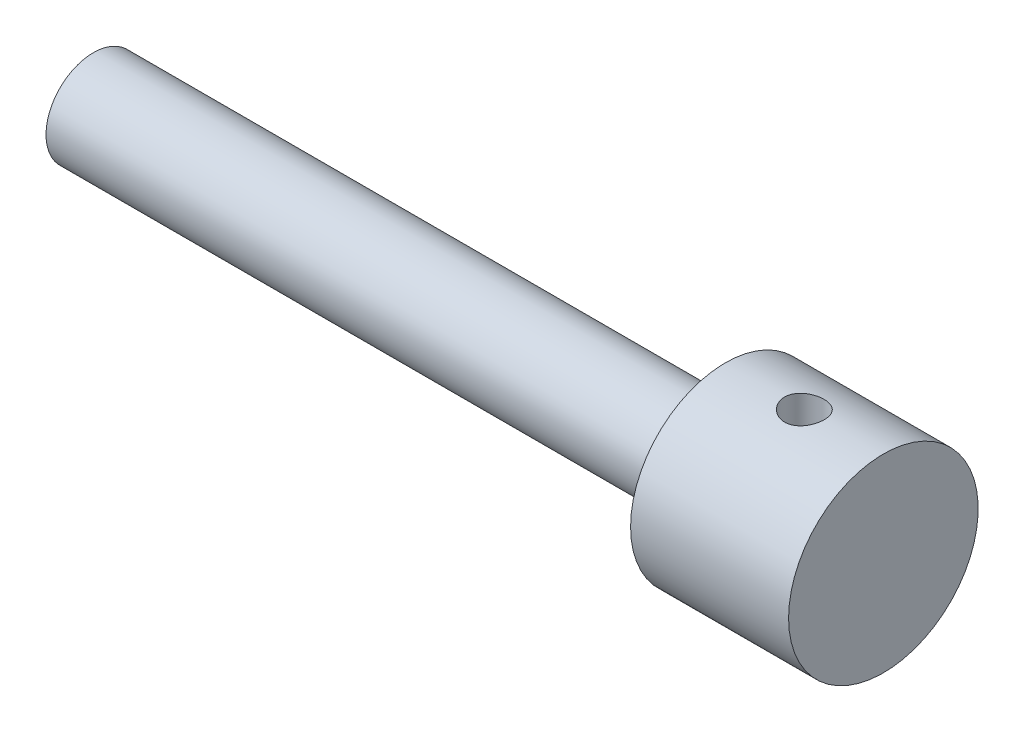
ISO-10303-21;
HEADER;
FILE_DESCRIPTION(('STEP AP214'),'2;1');
FILE_NAME('part.step','',(''),(''),'','','');
FILE_SCHEMA(('AUTOMOTIVE_DESIGN { 1 0 10303 214 1 1 1 1 }'));
ENDSEC;
DATA;
#1=APPLICATION_CONTEXT('core data for automotive mechanical design processes');
#2=APPLICATION_PROTOCOL_DEFINITION('international standard','automotive_design',2000,#1);
#3=PRODUCT_CONTEXT('',#1,'mechanical');
#4=PRODUCT('Part','Part','',(#3));
#5=PRODUCT_RELATED_PRODUCT_CATEGORY('part','',(#4));
#6=PRODUCT_DEFINITION_FORMATION('','',#4);
#7=PRODUCT_DEFINITION_CONTEXT('part definition',#1,'design');
#8=PRODUCT_DEFINITION('design','',#6,#7);
#9=PRODUCT_DEFINITION_SHAPE('','',#8);
#10=(LENGTH_UNIT() NAMED_UNIT(*) SI_UNIT(.MILLI.,.METRE.));
#11=(NAMED_UNIT(*) PLANE_ANGLE_UNIT() SI_UNIT($,.RADIAN.));
#12=(NAMED_UNIT(*) SI_UNIT($,.STERADIAN.) SOLID_ANGLE_UNIT());
#13=UNCERTAINTY_MEASURE_WITH_UNIT(LENGTH_MEASURE(1.E-05),#10,'distance_accuracy_value','');
#14=(GEOMETRIC_REPRESENTATION_CONTEXT(3) GLOBAL_UNCERTAINTY_ASSIGNED_CONTEXT((#13)) GLOBAL_UNIT_ASSIGNED_CONTEXT((#10,
#11,#12)) REPRESENTATION_CONTEXT('',''));
#15=CARTESIAN_POINT('',(0.,0.,0.));
#16=DIRECTION('',(0.,0.,1.));
#17=DIRECTION('',(1.,0.,0.));
#18=AXIS2_PLACEMENT_3D('',#15,#16,#17);
#19=CARTESIAN_POINT('',(0.,0.,0.));
#20=DIRECTION('',(1.,0.,0.));
#21=DIRECTION('',(0.,0.,-1.));
#22=AXIS2_PLACEMENT_3D('',#19,#20,#21);
#23=PLANE('',#22);
#24=CARTESIAN_POINT('',(0.,0.,0.));
#25=DIRECTION('',(-1.,0.,0.));
#26=DIRECTION('',(0.,0.,1.));
#27=AXIS2_PLACEMENT_3D('',#24,#25,#26);
#28=CIRCLE('',#27,6.);
#29=CARTESIAN_POINT('',(0.,0.,6.));
#30=VERTEX_POINT('',#29);
#31=EDGE_CURVE('E46',#30,#30,#28,.T.);
#32=ORIENTED_EDGE('',*,*,#31,.T.);
#33=EDGE_LOOP('',(#32));
#34=FACE_BOUND('',#33,.T.);
#35=ADVANCED_FACE('F31',(#34),#23,.F.);
#36=CARTESIAN_POINT('',(0.,0.,0.));
#37=DIRECTION('',(-1.,0.,0.));
#38=DIRECTION('',(0.,0.,1.));
#39=AXIS2_PLACEMENT_3D('',#36,#37,#38);
#40=CYLINDRICAL_SURFACE('',#39,6.);
#41=ORIENTED_EDGE('',*,*,#31,.F.);
#42=EDGE_LOOP('',(#41));
#43=FACE_BOUND('',#42,.T.);
#44=CARTESIAN_POINT('',(80.,0.,0.));
#45=DIRECTION('',(-1.,0.,0.));
#46=DIRECTION('',(0.,0.,1.));
#47=AXIS2_PLACEMENT_3D('',#44,#45,#46);
#48=CIRCLE('',#47,6.);
#49=CARTESIAN_POINT('',(80.,0.,6.));
#50=VERTEX_POINT('',#49);
#51=EDGE_CURVE('E50',#50,#50,#48,.T.);
#52=ORIENTED_EDGE('',*,*,#51,.T.);
#53=EDGE_LOOP('',(#52));
#54=FACE_BOUND('',#53,.T.);
#55=ADVANCED_FACE('F74',(#43,#54),#40,.T.);
#56=CARTESIAN_POINT('',(80.,6.,0.));
#57=DIRECTION('',(1.,0.,0.));
#58=DIRECTION('',(0.,0.,-1.));
#59=AXIS2_PLACEMENT_3D('',#56,#57,#58);
#60=PLANE('',#59);
#61=ORIENTED_EDGE('',*,*,#51,.F.);
#62=EDGE_LOOP('',(#61));
#63=FACE_BOUND('',#62,.T.);
#64=CARTESIAN_POINT('',(80.,0.,0.));
#65=DIRECTION('',(-1.,0.,0.));
#66=DIRECTION('',(0.,0.,1.));
#67=AXIS2_PLACEMENT_3D('',#64,#65,#66);
#68=CIRCLE('',#67,12.);
#69=CARTESIAN_POINT('',(80.,0.,12.));
#70=VERTEX_POINT('',#69);
#71=EDGE_CURVE('E85',#70,#70,#68,.T.);
#72=ORIENTED_EDGE('',*,*,#71,.T.);
#73=EDGE_LOOP('',(#72));
#74=FACE_BOUND('',#73,.T.);
#75=ADVANCED_FACE('F71',(#63,#74),#60,.F.);
#76=CARTESIAN_POINT('',(0.,0.,0.));
#77=DIRECTION('',(-1.,0.,0.));
#78=DIRECTION('',(0.,0.,1.));
#79=AXIS2_PLACEMENT_3D('',#76,#77,#78);
#80=CYLINDRICAL_SURFACE('',#79,12.);
#81=CARTESIAN_POINT('',(87.5,12.,0.));
#82=CARTESIAN_POINT('',(87.5000049549385,11.999997430533,-0.138818083403322));
#83=CARTESIAN_POINT('',(87.5116013314375,11.9975665755009,-0.277697579041751));
#84=CARTESIAN_POINT('',(87.5576386990657,11.9881040198136,-0.551522632533987));
#85=CARTESIAN_POINT('',(87.5920970460739,11.981068823785,-0.686465120256625));
#86=CARTESIAN_POINT('',(87.6827409098437,11.963182183924,-0.948418264582684));
#87=CARTESIAN_POINT('',(87.7389047919978,11.9523345410529,-1.07543667341837));
#88=CARTESIAN_POINT('',(87.8712992177124,11.9279985561972,-1.31824065721192));
#89=CARTESIAN_POINT('',(87.9475288623117,11.9145103325195,-1.43402673506865));
#90=CARTESIAN_POINT('',(88.1190726803813,11.886154000493,-1.65278064861767));
#91=CARTESIAN_POINT('',(88.2146240024702,11.8712701169706,-1.75556048832537));
#92=CARTESIAN_POINT('',(88.4215893183902,11.841913153849,-1.94375555353878));
#93=CARTESIAN_POINT('',(88.5330046237445,11.8274401083337,-2.02916934192197));
#94=CARTESIAN_POINT('',(88.7699039375323,11.8003888519062,-2.18102063354433));
#95=CARTESIAN_POINT('',(88.8955167690055,11.7878309034966,-2.24726109361301));
#96=CARTESIAN_POINT('',(89.1563949035455,11.7662568130004,-2.35762238696127));
#97=CARTESIAN_POINT('',(89.2916591648851,11.7572402893514,-2.40174560335282));
#98=CARTESIAN_POINT('',(89.5659704748313,11.7439300197224,-2.46600480267473));
#99=CARTESIAN_POINT('',(89.7049367186695,11.7395711371173,-2.48647195393597));
#100=CARTESIAN_POINT('',(89.9843936857253,11.7358738143298,-2.50386715311229));
#101=CARTESIAN_POINT('',(90.1248842377306,11.7365348160196,-2.50079781789373));
#102=CARTESIAN_POINT('',(90.4009620559504,11.7427434863835,-2.47147438074394));
#103=CARTESIAN_POINT('',(90.5365919593224,11.748210673598,-2.4456021046544));
#104=CARTESIAN_POINT('',(90.8015430192899,11.7632887523188,-2.3720108705989));
#105=CARTESIAN_POINT('',(90.9308638512127,11.7728998568263,-2.32429078962764));
#106=CARTESIAN_POINT('',(91.180614456832,11.795263829282,-2.20800006427857));
#107=CARTESIAN_POINT('',(91.3009725930542,11.8080390757117,-2.13928005068473));
#108=CARTESIAN_POINT('',(91.5285914885363,11.8352778002144,-1.98304539854963));
#109=CARTESIAN_POINT('',(91.635850617672,11.8497414879707,-1.89552842452517));
#110=CARTESIAN_POINT('',(91.8364279221608,11.8790746185982,-1.70214984309356));
#111=CARTESIAN_POINT('',(91.929432337794,11.8939464639895,-1.59596286682416));
#112=CARTESIAN_POINT('',(92.096360884458,11.92216176286,-1.36933457722359));
#113=CARTESIAN_POINT('',(92.1702847291968,11.9355051934047,-1.24889305005153));
#114=CARTESIAN_POINT('',(92.2970201630719,11.9591974188563,-0.996811082470948));
#115=CARTESIAN_POINT('',(92.3497936091342,11.9695407942052,-0.86515092385299));
#116=CARTESIAN_POINT('',(92.432383409671,11.9860267642256,-0.594569241944301));
#117=CARTESIAN_POINT('',(92.4622027864628,11.9921699119211,-0.455648677190173));
#118=CARTESIAN_POINT('',(92.4975885041358,11.9994855043091,-0.177183731401668));
#119=CARTESIAN_POINT('',(92.5035838829885,12.0007458707516,-0.0376961110523548));
#120=CARTESIAN_POINT('',(92.4923101000618,11.9983990450555,0.24028759751543));
#121=CARTESIAN_POINT('',(92.4750423627968,11.9947921509631,0.378783745924516));
#122=CARTESIAN_POINT('',(92.4180886930609,11.9831712995837,0.649452734239627));
#123=CARTESIAN_POINT('',(92.3786250292331,11.9752010573615,0.781674385788414));
#124=CARTESIAN_POINT('',(92.2786442791572,11.9557445448479,1.03762289332266));
#125=CARTESIAN_POINT('',(92.218125518268,11.9442579948916,1.16134907267355));
#126=CARTESIAN_POINT('',(92.0768392435249,11.9188248298143,1.39858861388699));
#127=CARTESIAN_POINT('',(91.9958161408619,11.9048478762466,1.51194643893966));
#128=CARTESIAN_POINT('',(91.8161608738475,11.8760513659942,1.72361089177304));
#129=CARTESIAN_POINT('',(91.7175266489621,11.8612317108502,1.82191575582657));
#130=CARTESIAN_POINT('',(91.5034888460006,11.8321204906275,2.0023572973036));
#131=CARTESIAN_POINT('',(91.3878339360895,11.81784178615,2.08419829200408));
#132=CARTESIAN_POINT('',(91.1441674315724,11.7917120203161,2.22729438158486));
#133=CARTESIAN_POINT('',(91.0161563517218,11.779860857893,2.28855033355728));
#134=CARTESIAN_POINT('',(90.7520776074035,11.7600340141608,2.38834492887844));
#135=CARTESIAN_POINT('',(90.6160579256683,11.7520374556937,2.42700619656063));
#136=CARTESIAN_POINT('',(90.3392668990155,11.7407836941939,2.48088077046814));
#137=CARTESIAN_POINT('',(90.1984962367611,11.7375258132073,2.49609743088881));
#138=CARTESIAN_POINT('',(89.9191731980007,11.7361581461701,2.50251852975222));
#139=CARTESIAN_POINT('',(89.7806318595559,11.73794804643,2.4941908524545));
#140=CARTESIAN_POINT('',(89.5069719821596,11.7462489450985,2.45479810628063));
#141=CARTESIAN_POINT('',(89.3718534103678,11.7527598981925,2.42373325564532));
#142=CARTESIAN_POINT('',(89.1092044562187,11.7697226489543,2.33996435537169));
#143=CARTESIAN_POINT('',(88.9816535070262,11.7801631401586,2.28732235136842));
#144=CARTESIAN_POINT('',(88.7371224479467,11.8038141147748,2.16194914599514));
#145=CARTESIAN_POINT('',(88.6201433207338,11.8170248553092,2.0892160796606));
#146=CARTESIAN_POINT('',(88.3977567458411,11.8450315910229,1.92414739068482));
#147=CARTESIAN_POINT('',(88.29260175087,11.8598522773681,1.83147578083645));
#148=CARTESIAN_POINT('',(88.0991810135473,11.8892367916643,1.62984887623067));
#149=CARTESIAN_POINT('',(88.010919164897,11.9038005596976,1.52088983766594));
#150=CARTESIAN_POINT('',(87.8528228536319,11.9312288909527,1.28826885501541));
#151=CARTESIAN_POINT('',(87.7832126402274,11.9440719214649,1.1644518430427));
#152=CARTESIAN_POINT('',(87.66589954314,11.9663981698818,0.906639687996905));
#153=CARTESIAN_POINT('',(87.6181775056363,11.975884323642,0.772653563814483));
#154=CARTESIAN_POINT('',(87.5549194434232,11.9886499956289,0.532030585800206));
#155=CARTESIAN_POINT('',(87.5343624735823,11.9928807132279,0.426735187455855));
#156=CARTESIAN_POINT('',(87.5069010914453,11.9985566557952,0.214305348353073));
#157=CARTESIAN_POINT('',(87.4999961746656,12.0000019836917,0.107170975697743));
#158=CARTESIAN_POINT('',(87.5,12.,0.));
#159=B_SPLINE_CURVE_WITH_KNOTS('',3,(#81,#82,#83,#84,#85,#86,#87,#88,#89,#90,#91,#92,#93,#94,
#95,#96,#97,#98,#99,#100,#101,#102,#103,#104,#105,#106,#107,#108,#109,#110,#111,#112,#113,#114,
#115,#116,#117,#118,#119,#120,#121,#122,#123,#124,#125,#126,#127,#128,#129,#130,#131,#132,#133,
#134,#135,#136,#137,#138,#139,#140,#141,#142,#143,#144,#145,#146,#147,#148,#149,#150,#151,#152,
#153,#154,#155,#156,#157,#158),.UNSPECIFIED.,.T.,.F.,(4,2,2,2,2,2,2,2,2,2,2,2,2,2,2,2,2,2,2,2,2,
2,2,2,2,2,2,2,2,2,2,2,2,2,2,2,2,2,4),(0.,0.416062090206366,0.832440399812449,1.24840475765089,
1.66435048314598,2.08575052776244,2.50718543103571,2.93280898357096,3.3583866657098,
3.77793150339708,4.19742969534329,4.61003424258117,5.02266000060558,5.43829184833498,
5.85397536736069,6.27779052710931,6.70161204556436,7.12619448999325,7.55072102091542,
7.9675667881535,8.38438703104554,8.79710573265242,9.20985726781866,9.62803167991471,
10.0462550512915,10.4714252765867,10.8965777970262,11.3194010019005,11.7421637082837,
12.1565844658208,12.5710012456272,12.9842346278651,13.3975063816296,13.8183804966062,
14.2393515023474,14.6651772879651,15.0906297292995,15.4118517695456,15.7330619394678),.UNSPECIFIED.);
#160=CARTESIAN_POINT('',(87.5,12.,0.));
#161=VERTEX_POINT('',#160);
#162=EDGE_CURVE('E10',#161,#161,#159,.T.);
#163=ORIENTED_EDGE('',*,*,#162,.T.);
#164=EDGE_LOOP('',(#163));
#165=FACE_BOUND('',#164,.T.);
#166=CARTESIAN_POINT('',(90.,-11.7366945943055,-2.5));
#167=CARTESIAN_POINT('',(89.8612187696963,-11.7366973843002,-2.49999501755299));
#168=CARTESIAN_POINT('',(89.7223760559691,-11.7391829184982,-2.48840458867922));
#169=CARTESIAN_POINT('',(89.448627365366,-11.7488403116286,-2.44239298467531));
#170=CARTESIAN_POINT('',(89.3137244889873,-11.7560157627658,-2.40795430880677));
#171=CARTESIAN_POINT('',(89.0518552543301,-11.7742058592406,-2.31736795014467));
#172=CARTESIAN_POINT('',(88.9248808080164,-11.7852165141394,-2.26124282497866));
#173=CARTESIAN_POINT('',(88.6821510007088,-11.8098316267143,-2.12893977203462));
#174=CARTESIAN_POINT('',(88.56639518654,-11.8234359795523,-2.05276265471639));
#175=CARTESIAN_POINT('',(88.3476092496931,-11.8519386932295,-1.88127279893217));
#176=CARTESIAN_POINT('',(88.2447762127471,-11.8668522874608,-1.78571110973933));
#177=CARTESIAN_POINT('',(88.0564778627038,-11.8961593360515,-1.57870244776127));
#178=CARTESIAN_POINT('',(87.9710138234171,-11.9105527521983,-1.467254310912));
#179=CARTESIAN_POINT('',(87.8191082238343,-11.937362702377,-1.23032410599918));
#180=CARTESIAN_POINT('',(87.7528549470735,-11.9497591726249,-1.10471885640989));
#181=CARTESIAN_POINT('',(87.6424678942805,-11.971006946866,-0.843857102013443));
#182=CARTESIAN_POINT('',(87.598331869693,-11.9798586112244,-0.708601579901186));
#183=CARTESIAN_POINT('',(87.5340484777651,-11.9929117978436,-0.434325808401008));
#184=CARTESIAN_POINT('',(87.5135679656097,-11.9971778391985,-0.295386761832718));
#185=CARTESIAN_POINT('',(87.496136608486,-12.0008022516122,-0.0159836976790503));
#186=CARTESIAN_POINT('',(87.4991833116138,-12.0001611340738,0.124480159473676));
#187=CARTESIAN_POINT('',(87.5284692019135,-11.9940931618102,0.400653172399142));
#188=CARTESIAN_POINT('',(87.5543494379162,-11.9887403791317,0.536402257452947));
#189=CARTESIAN_POINT('',(87.6279972506626,-11.9739344179777,0.8015874925795));
#190=CARTESIAN_POINT('',(87.6757657544062,-11.9644810658381,0.93102337502204));
#191=CARTESIAN_POINT('',(87.792160104251,-11.9424153464785,1.18092001076936));
#192=CARTESIAN_POINT('',(87.8609245884193,-11.9297820825069,1.30131426996329));
#193=CARTESIAN_POINT('',(88.0172560056808,-11.9027460088038,1.52898691302129));
#194=CARTESIAN_POINT('',(88.1048252764123,-11.8883429791665,1.63626366363284));
#195=CARTESIAN_POINT('',(88.2982432497821,-11.8590340046655,1.83678840655382));
#196=CARTESIAN_POINT('',(88.4044061199639,-11.8441236995185,1.92973297498958));
#197=CARTESIAN_POINT('',(88.6309640979896,-11.8157374529799,2.09655194480975));
#198=CARTESIAN_POINT('',(88.7513595227745,-11.8022615435432,2.17042592139959));
#199=CARTESIAN_POINT('',(89.0034245096576,-11.7782599681831,2.29712434276908));
#200=CARTESIAN_POINT('',(89.1351213013869,-11.7677417046425,2.34989610979454));
#201=CARTESIAN_POINT('',(89.4057832387388,-11.7509521282072,2.43247155077345));
#202=CARTESIAN_POINT('',(89.5447473456162,-11.7446802101436,2.46227849764697));
#203=CARTESIAN_POINT('',(89.8232394126378,-11.7372156647826,2.49761727734034));
#204=CARTESIAN_POINT('',(89.9627091690741,-11.7359310372695,2.50358885835996));
#205=CARTESIAN_POINT('',(90.2406516230803,-11.7383390403741,2.49227386878588));
#206=CARTESIAN_POINT('',(90.3791243818047,-11.7420313630525,2.47498873715725));
#207=CARTESIAN_POINT('',(90.6496410321163,-11.7538907645233,2.41803116650967));
#208=CARTESIAN_POINT('',(90.7817373343577,-11.7620102256599,2.37859682753742));
#209=CARTESIAN_POINT('',(91.0374479788832,-11.7817667700624,2.27871621721838));
#210=CARTESIAN_POINT('',(91.1610615713008,-11.7934041638211,2.21826809112292));
#211=CARTESIAN_POINT('',(91.3982128824325,-11.8190900387438,2.07709196362969));
#212=CARTESIAN_POINT('',(91.5115844089323,-11.8331701329665,1.99609065470792));
#213=CARTESIAN_POINT('',(91.7232864983101,-11.8620696798782,1.81646888113976));
#214=CARTESIAN_POINT('',(91.8216153724785,-11.8768892153306,1.71784644101035));
#215=CARTESIAN_POINT('',(92.0021254261943,-11.9058984863347,1.50380090168669));
#216=CARTESIAN_POINT('',(92.0840081900528,-11.9200734943982,1.38812381522911));
#217=CARTESIAN_POINT('',(92.227177504176,-11.9459341754481,1.14440020443272));
#218=CARTESIAN_POINT('',(92.2884649644749,-11.9576199584164,1.01635422695376));
#219=CARTESIAN_POINT('',(92.3882773586347,-11.9771229654136,0.752284235695839));
#220=CARTESIAN_POINT('',(92.4269383310887,-11.9849632627299,0.616313421940391));
#221=CARTESIAN_POINT('',(92.4808288080162,-11.9959912282046,0.339626801006942));
#222=CARTESIAN_POINT('',(92.4960613870655,-11.9991795068579,0.198911618923384));
#223=CARTESIAN_POINT('',(92.502535244097,-12.0005281611387,-0.0804266869406725));
#224=CARTESIAN_POINT('',(92.4942237999895,-11.9987822750957,-0.219039184355822));
#225=CARTESIAN_POINT('',(92.4548387226941,-11.99065748189,-0.492845740747126));
#226=CARTESIAN_POINT('',(92.4237654271863,-11.9842786434588,-0.628039850405486));
#227=CARTESIAN_POINT('',(92.339944410703,-11.9676092015489,-0.890863930984017));
#228=CARTESIAN_POINT('',(92.2872546722943,-11.9573290681437,-1.01851310000873));
#229=CARTESIAN_POINT('',(92.1617552045355,-11.9339599069615,-1.26322113444179));
#230=CARTESIAN_POINT('',(92.0889437233117,-11.9208706346327,-1.38027907656018));
#231=CARTESIAN_POINT('',(91.9237806640155,-11.8930319356995,-1.60268064259533));
#232=CARTESIAN_POINT('',(91.8311114238945,-11.8782576059507,-1.70778526722739));
#233=CARTESIAN_POINT('',(91.6295109979979,-11.8488557363333,-1.90110548396523));
#234=CARTESIAN_POINT('',(91.5205759400736,-11.8342282323044,-1.98931704315914));
#235=CARTESIAN_POINT('',(91.287981795159,-11.8065838324643,-2.14734903704121));
#236=CARTESIAN_POINT('',(91.1641631771794,-11.7935881325424,-2.21693856248135));
#237=CARTESIAN_POINT('',(90.9063496879379,-11.7709407916825,-2.33421255844769));
#238=CARTESIAN_POINT('',(90.7723639031215,-11.7612862067076,-2.38191632583499));
#239=CARTESIAN_POINT('',(90.5317874368468,-11.7482800883641,-2.44513108264677));
#240=CARTESIAN_POINT('',(90.4265409268095,-11.7439632719021,-2.46566898011598));
#241=CARTESIAN_POINT('',(90.2142084389624,-11.7381695052653,-2.4931050871655));
#242=CARTESIAN_POINT('',(90.1071225353813,-11.7366924407628,-2.50000384585404));
#243=CARTESIAN_POINT('',(90.,-11.7366945943055,-2.5));
#244=B_SPLINE_CURVE_WITH_KNOTS('',3,(#166,#167,#168,#169,#170,#171,#172,#173,#174,#175,#176,
#177,#178,#179,#180,#181,#182,#183,#184,#185,#186,#187,#188,#189,#190,#191,#192,#193,#194,#195,
#196,#197,#198,#199,#200,#201,#202,#203,#204,#205,#206,#207,#208,#209,#210,#211,#212,#213,#214,
#215,#216,#217,#218,#219,#220,#221,#222,#223,#224,#225,#226,#227,#228,#229,#230,#231,#232,#233,
#234,#235,#236,#237,#238,#239,#240,#241,#242,#243),.UNSPECIFIED.,.T.,.F.,(4,2,2,2,2,2,2,2,2,2,2,
2,2,2,2,2,2,2,2,2,2,2,2,2,2,2,2,2,2,2,2,2,2,2,2,2,2,2,4),(0.,0.415951308142525,0.83222158483494,
1.24806002960546,1.66388166963158,2.08542666935771,2.50700257327746,2.93258052533686,
3.35811520213865,3.77758097718528,4.19700303792677,4.60994682832921,5.0229081091174,
5.43865743955897,5.85445848208518,6.27811724489825,6.70178544383255,7.12650474664974,
7.55116350775191,7.96795032019582,8.38471134593046,8.79707572463843,9.2094765092806,
9.627678358693,10.0459271216437,10.4711891750668,10.8964324351808,11.3190919929707,
11.7416960791916,12.1563258784529,12.5709495266596,12.984468211702,13.3980229105635,
13.8187663795714,14.2396101685507,14.6654530271771,15.0909196914727,15.4119973517483,
15.7330620852561),.UNSPECIFIED.);
#245=CARTESIAN_POINT('',(90.,-11.7366945943055,-2.5));
#246=VERTEX_POINT('',#245);
#247=EDGE_CURVE('E42',#246,#246,#244,.T.);
#248=ORIENTED_EDGE('',*,*,#247,.T.);
#249=EDGE_LOOP('',(#248));
#250=FACE_BOUND('',#249,.T.);
#251=ORIENTED_EDGE('',*,*,#71,.F.);
#252=EDGE_LOOP('',(#251));
#253=FACE_BOUND('',#252,.T.);
#254=CARTESIAN_POINT('',(100.,0.,0.));
#255=DIRECTION('',(-1.,0.,0.));
#256=DIRECTION('',(0.,0.,1.));
#257=AXIS2_PLACEMENT_3D('',#254,#255,#256);
#258=CIRCLE('',#257,12.);
#259=CARTESIAN_POINT('',(100.,0.,12.));
#260=VERTEX_POINT('',#259);
#261=EDGE_CURVE('E87',#260,#260,#258,.T.);
#262=ORIENTED_EDGE('',*,*,#261,.T.);
#263=EDGE_LOOP('',(#262));
#264=FACE_BOUND('',#263,.T.);
#265=ADVANCED_FACE('F56',(#165,#250,#253,#264),#80,.T.);
#266=CARTESIAN_POINT('',(100.,12.,0.));
#267=DIRECTION('',(-1.,0.,0.));
#268=DIRECTION('',(0.,0.,1.));
#269=AXIS2_PLACEMENT_3D('',#266,#267,#268);
#270=PLANE('',#269);
#271=ORIENTED_EDGE('',*,*,#261,.F.);
#272=EDGE_LOOP('',(#271));
#273=FACE_BOUND('',#272,.T.);
#274=ADVANCED_FACE('F63',(#273),#270,.F.);
#275=CARTESIAN_POINT('',(90.,-12.,0.));
#276=DIRECTION('',(0.,-1.,0.));
#277=DIRECTION('',(0.,0.,-1.));
#278=AXIS2_PLACEMENT_3D('',#275,#276,#277);
#279=CYLINDRICAL_SURFACE('',#278,2.5);
#280=ORIENTED_EDGE('',*,*,#247,.F.);
#281=EDGE_LOOP('',(#280));
#282=FACE_BOUND('',#281,.T.);
#283=ORIENTED_EDGE('',*,*,#162,.F.);
#284=EDGE_LOOP('',(#283));
#285=FACE_BOUND('',#284,.T.);
#286=ADVANCED_FACE('F60',(#282,#285),#279,.F.);
#287=CLOSED_SHELL('',(#35,#55,#75,#265,#274,#286));
#288=MANIFOLD_SOLID_BREP('B2',#287);
#289=ADVANCED_BREP_SHAPE_REPRESENTATION('',(#18,#288),#14);
#290=SHAPE_DEFINITION_REPRESENTATION(#9,#289);
ENDSEC;
END-ISO-10303-21;
